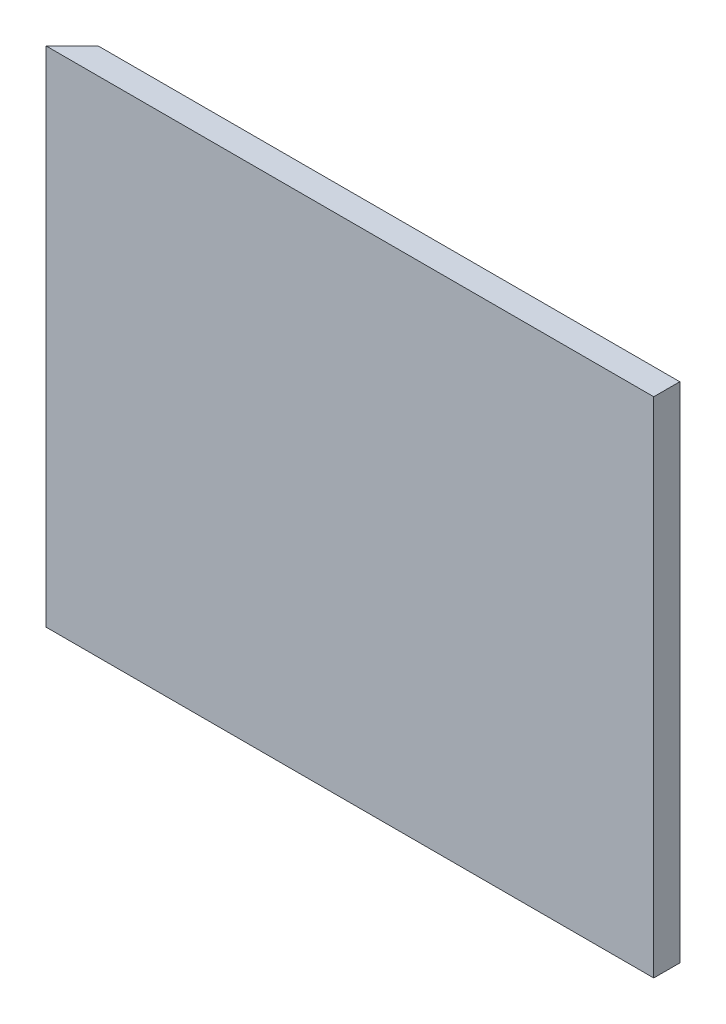
ISO-10303-21;
HEADER;
FILE_DESCRIPTION(('STEP AP214'),'2;1');
FILE_NAME('part.step','',(''),(''),'','','');
FILE_SCHEMA(('AUTOMOTIVE_DESIGN { 1 0 10303 214 1 1 1 1 }'));
ENDSEC;
DATA;
#1=APPLICATION_CONTEXT('core data for automotive mechanical design processes');
#2=APPLICATION_PROTOCOL_DEFINITION('international standard','automotive_design',2000,#1);
#3=PRODUCT_CONTEXT('',#1,'mechanical');
#4=PRODUCT('Part','Part','',(#3));
#5=PRODUCT_RELATED_PRODUCT_CATEGORY('part','',(#4));
#6=PRODUCT_DEFINITION_FORMATION('','',#4);
#7=PRODUCT_DEFINITION_CONTEXT('part definition',#1,'design');
#8=PRODUCT_DEFINITION('design','',#6,#7);
#9=PRODUCT_DEFINITION_SHAPE('','',#8);
#10=(LENGTH_UNIT() NAMED_UNIT(*) SI_UNIT(.MILLI.,.METRE.));
#11=(NAMED_UNIT(*) PLANE_ANGLE_UNIT() SI_UNIT($,.RADIAN.));
#12=(NAMED_UNIT(*) SI_UNIT($,.STERADIAN.) SOLID_ANGLE_UNIT());
#13=UNCERTAINTY_MEASURE_WITH_UNIT(LENGTH_MEASURE(1.E-05),#10,'distance_accuracy_value','');
#14=(GEOMETRIC_REPRESENTATION_CONTEXT(3) GLOBAL_UNCERTAINTY_ASSIGNED_CONTEXT((#13)) GLOBAL_UNIT_ASSIGNED_CONTEXT((#10,
#11,#12)) REPRESENTATION_CONTEXT('',''));
#15=CARTESIAN_POINT('',(0.,0.,0.));
#16=DIRECTION('',(0.,0.,1.));
#17=DIRECTION('',(1.,0.,0.));
#18=AXIS2_PLACEMENT_3D('',#15,#16,#17);
#19=CARTESIAN_POINT('',(-90.379084176495,110.977207270869,3.));
#20=DIRECTION('',(-1.,0.,0.));
#21=DIRECTION('',(0.,0.,1.));
#22=AXIS2_PLACEMENT_3D('',#19,#20,#21);
#23=PLANE('',#22);
#24=DIRECTION('',(0.,1.,0.));
#25=VECTOR('',#24,1.);
#26=CARTESIAN_POINT('',(-90.379084176495,110.977207270869,0.));
#27=LINE('',#26,#25);
#28=CARTESIAN_POINT('',(-90.379084176495,52.9772072708686,0.));
#29=VERTEX_POINT('',#28);
#30=CARTESIAN_POINT('',(-90.379084176495,110.977207270869,0.));
#31=VERTEX_POINT('',#30);
#32=EDGE_CURVE('E101',#29,#31,#27,.T.);
#33=ORIENTED_EDGE('',*,*,#32,.T.);
#34=DIRECTION('',(0.,0.,-1.));
#35=VECTOR('',#34,1.);
#36=CARTESIAN_POINT('',(-90.379084176495,110.977207270869,3.));
#37=LINE('',#36,#35);
#38=CARTESIAN_POINT('',(-90.379084176495,110.977207270869,3.));
#39=VERTEX_POINT('',#38);
#40=EDGE_CURVE('E83',#39,#31,#37,.T.);
#41=ORIENTED_EDGE('',*,*,#40,.F.);
#42=DIRECTION('',(0.,1.,0.));
#43=VECTOR('',#42,1.);
#44=CARTESIAN_POINT('',(-90.379084176495,110.977207270869,3.));
#45=LINE('',#44,#43);
#46=CARTESIAN_POINT('',(-90.379084176495,52.9772072708686,3.));
#47=VERTEX_POINT('',#46);
#48=EDGE_CURVE('E90',#47,#39,#45,.T.);
#49=ORIENTED_EDGE('',*,*,#48,.F.);
#50=DIRECTION('',(0.,0.,-1.));
#51=VECTOR('',#50,1.);
#52=CARTESIAN_POINT('',(-90.379084176495,52.9772072708686,3.));
#53=LINE('',#52,#51);
#54=EDGE_CURVE('E102',#47,#29,#53,.T.);
#55=ORIENTED_EDGE('',*,*,#54,.T.);
#56=EDGE_LOOP('',(#33,#41,#49,#55));
#57=FACE_BOUND('',#56,.T.);
#58=ADVANCED_FACE('F39',(#57),#23,.F.);
#59=CARTESIAN_POINT('',(-90.379084176495,110.977207270869,3.));
#60=DIRECTION('',(0.,-1.,0.));
#61=DIRECTION('',(0.,0.,-1.));
#62=AXIS2_PLACEMENT_3D('',#59,#60,#61);
#63=PLANE('',#62);
#64=DIRECTION('',(-1.,0.,0.));
#65=VECTOR('',#64,1.);
#66=CARTESIAN_POINT('',(-90.379084176495,110.977207270869,0.));
#67=LINE('',#66,#65);
#68=CARTESIAN_POINT('',(-157.379084176495,110.977207270869,0.));
#69=VERTEX_POINT('',#68);
#70=EDGE_CURVE('E108',#31,#69,#67,.T.);
#71=ORIENTED_EDGE('',*,*,#70,.T.);
#72=DIRECTION('',(-0.707106781186546,0.,0.707106781186549));
#73=VECTOR('',#72,1.);
#74=CARTESIAN_POINT('',(-160.379084176495,110.977207270869,2.99999999999999));
#75=LINE('',#74,#73);
#76=CARTESIAN_POINT('',(-160.379084176495,110.977207270869,3.));
#77=VERTEX_POINT('',#76);
#78=EDGE_CURVE('E11',#69,#77,#75,.T.);
#79=ORIENTED_EDGE('',*,*,#78,.T.);
#80=DIRECTION('',(-1.,0.,0.));
#81=VECTOR('',#80,1.);
#82=CARTESIAN_POINT('',(-90.379084176495,110.977207270869,3.));
#83=LINE('',#82,#81);
#84=EDGE_CURVE('E79',#39,#77,#83,.T.);
#85=ORIENTED_EDGE('',*,*,#84,.F.);
#86=ORIENTED_EDGE('',*,*,#40,.T.);
#87=EDGE_LOOP('',(#71,#79,#85,#86));
#88=FACE_BOUND('',#87,.T.);
#89=ADVANCED_FACE('F81',(#88),#63,.F.);
#90=CARTESIAN_POINT('',(-90.379084176495,52.9772072708686,3.));
#91=DIRECTION('',(0.,1.,0.));
#92=DIRECTION('',(0.,0.,1.));
#93=AXIS2_PLACEMENT_3D('',#90,#91,#92);
#94=PLANE('',#93);
#95=DIRECTION('',(1.,0.,0.));
#96=VECTOR('',#95,1.);
#97=CARTESIAN_POINT('',(-90.379084176495,52.9772072708686,3.));
#98=LINE('',#97,#96);
#99=CARTESIAN_POINT('',(-160.379084176495,52.9772072708686,3.));
#100=VERTEX_POINT('',#99);
#101=EDGE_CURVE('E94',#100,#47,#98,.T.);
#102=ORIENTED_EDGE('',*,*,#101,.F.);
#103=DIRECTION('',(0.707106781186546,0.,-0.707106781186549));
#104=VECTOR('',#103,1.);
#105=CARTESIAN_POINT('',(-160.379084176495,52.9772072708686,2.99999999999998));
#106=LINE('',#105,#104);
#107=CARTESIAN_POINT('',(-157.379084176495,52.9772072708686,0.));
#108=VERTEX_POINT('',#107);
#109=EDGE_CURVE('E62',#100,#108,#106,.T.);
#110=ORIENTED_EDGE('',*,*,#109,.T.);
#111=DIRECTION('',(1.,0.,0.));
#112=VECTOR('',#111,1.);
#113=CARTESIAN_POINT('',(-90.379084176495,52.9772072708686,0.));
#114=LINE('',#113,#112);
#115=EDGE_CURVE('E98',#108,#29,#114,.T.);
#116=ORIENTED_EDGE('',*,*,#115,.T.);
#117=ORIENTED_EDGE('',*,*,#54,.F.);
#118=EDGE_LOOP('',(#102,#110,#116,#117));
#119=FACE_BOUND('',#118,.T.);
#120=ADVANCED_FACE('F113',(#119),#94,.F.);
#121=CARTESIAN_POINT('',(0.,0.,3.));
#122=DIRECTION('',(0.,0.,-1.));
#123=DIRECTION('',(-1.,0.,0.));
#124=AXIS2_PLACEMENT_3D('',#121,#122,#123);
#125=PLANE('',#124);
#126=ORIENTED_EDGE('',*,*,#48,.T.);
#127=ORIENTED_EDGE('',*,*,#84,.T.);
#128=DIRECTION('',(0.,-1.,0.));
#129=VECTOR('',#128,1.);
#130=CARTESIAN_POINT('',(-160.379084176495,110.977207270869,3.));
#131=LINE('',#130,#129);
#132=EDGE_CURVE('E89',#77,#100,#131,.T.);
#133=ORIENTED_EDGE('',*,*,#132,.T.);
#134=ORIENTED_EDGE('',*,*,#101,.T.);
#135=EDGE_LOOP('',(#126,#127,#133,#134));
#136=FACE_BOUND('',#135,.T.);
#137=ADVANCED_FACE('F93',(#136),#125,.F.);
#138=CARTESIAN_POINT('',(0.,0.,0.));
#139=DIRECTION('',(0.,0.,-1.));
#140=DIRECTION('',(-1.,0.,0.));
#141=AXIS2_PLACEMENT_3D('',#138,#139,#140);
#142=PLANE('',#141);
#143=ORIENTED_EDGE('',*,*,#115,.F.);
#144=DIRECTION('',(0.,1.,0.));
#145=VECTOR('',#144,1.);
#146=CARTESIAN_POINT('',(-157.379084176495,110.977207270869,0.));
#147=LINE('',#146,#145);
#148=EDGE_CURVE('E48',#108,#69,#147,.T.);
#149=ORIENTED_EDGE('',*,*,#148,.T.);
#150=ORIENTED_EDGE('',*,*,#70,.F.);
#151=ORIENTED_EDGE('',*,*,#32,.F.);
#152=EDGE_LOOP('',(#143,#149,#150,#151));
#153=FACE_BOUND('',#152,.T.);
#154=ADVANCED_FACE('F114',(#153),#142,.T.);
#155=CARTESIAN_POINT('',(-160.379084176495,110.977207270869,2.99999999999999));
#156=DIRECTION('',(-0.707106781186549,0.,-0.707106781186546));
#157=DIRECTION('',(0.,1.,0.));
#158=AXIS2_PLACEMENT_3D('',#155,#156,#157);
#159=PLANE('',#158);
#160=ORIENTED_EDGE('',*,*,#78,.F.);
#161=ORIENTED_EDGE('',*,*,#148,.F.);
#162=ORIENTED_EDGE('',*,*,#109,.F.);
#163=ORIENTED_EDGE('',*,*,#132,.F.);
#164=EDGE_LOOP('',(#160,#161,#162,#163));
#165=FACE_BOUND('',#164,.T.);
#166=ADVANCED_FACE('F42',(#165),#159,.T.);
#167=CLOSED_SHELL('',(#58,#89,#120,#137,#154,#166));
#168=MANIFOLD_SOLID_BREP('B2',#167);
#169=ADVANCED_BREP_SHAPE_REPRESENTATION('',(#18,#168),#14);
#170=SHAPE_DEFINITION_REPRESENTATION(#9,#169);
ENDSEC;
END-ISO-10303-21;
